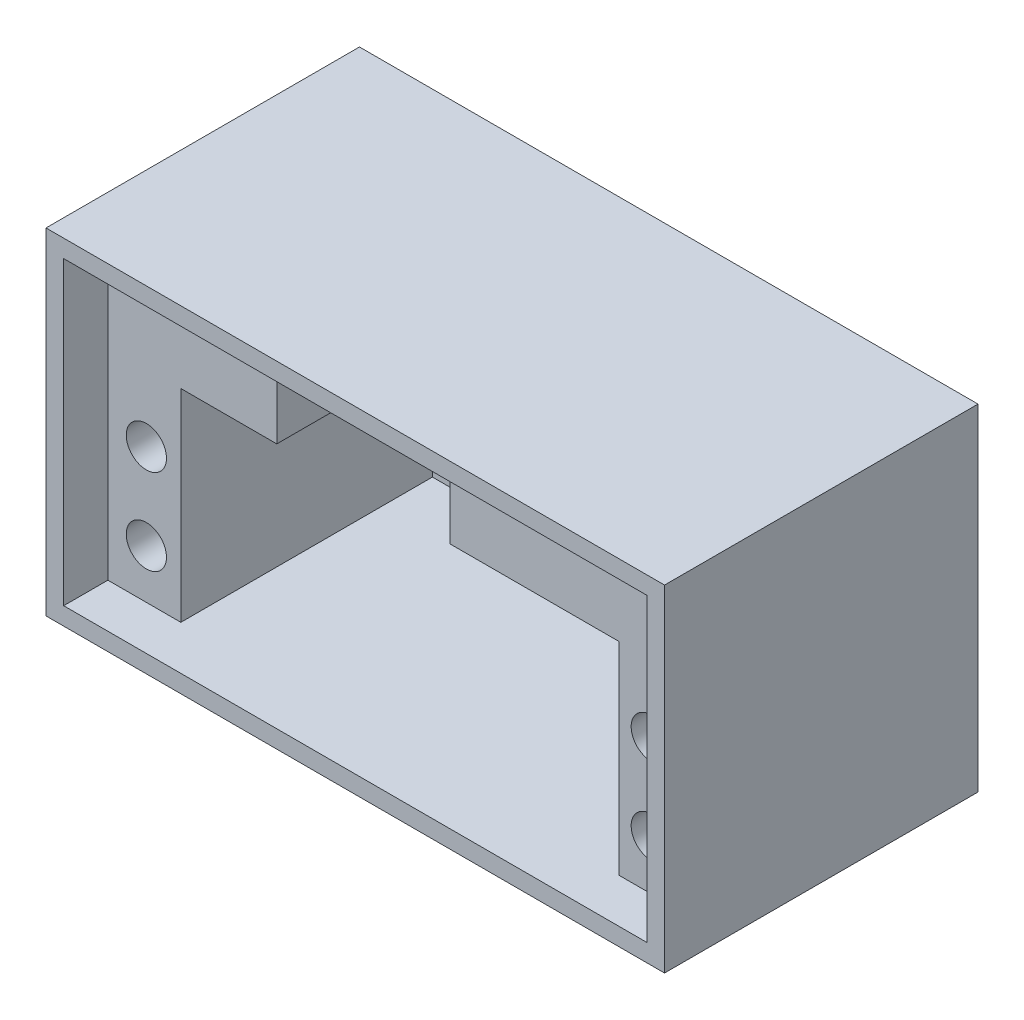
ISO-10303-21;
HEADER;
FILE_DESCRIPTION(('STEP AP214'),'2;1');
FILE_NAME('part.step','',(''),(''),'','','');
FILE_SCHEMA(('AUTOMOTIVE_DESIGN { 1 0 10303 214 1 1 1 1 }'));
ENDSEC;
DATA;
#1=APPLICATION_CONTEXT('core data for automotive mechanical design processes');
#2=APPLICATION_PROTOCOL_DEFINITION('international standard','automotive_design',2000,#1);
#3=PRODUCT_CONTEXT('',#1,'mechanical');
#4=PRODUCT('Part','Part','',(#3));
#5=PRODUCT_RELATED_PRODUCT_CATEGORY('part','',(#4));
#6=PRODUCT_DEFINITION_FORMATION('','',#4);
#7=PRODUCT_DEFINITION_CONTEXT('part definition',#1,'design');
#8=PRODUCT_DEFINITION('design','',#6,#7);
#9=PRODUCT_DEFINITION_SHAPE('','',#8);
#10=(LENGTH_UNIT() NAMED_UNIT(*) SI_UNIT(.MILLI.,.METRE.));
#11=(NAMED_UNIT(*) PLANE_ANGLE_UNIT() SI_UNIT($,.RADIAN.));
#12=(NAMED_UNIT(*) SI_UNIT($,.STERADIAN.) SOLID_ANGLE_UNIT());
#13=UNCERTAINTY_MEASURE_WITH_UNIT(LENGTH_MEASURE(1.E-05),#10,'distance_accuracy_value','');
#14=(GEOMETRIC_REPRESENTATION_CONTEXT(3) GLOBAL_UNCERTAINTY_ASSIGNED_CONTEXT((#13)) GLOBAL_UNIT_ASSIGNED_CONTEXT((#10,
#11,#12)) REPRESENTATION_CONTEXT('',''));
#15=CARTESIAN_POINT('',(0.,0.,0.));
#16=DIRECTION('',(0.,0.,1.));
#17=DIRECTION('',(1.,0.,0.));
#18=AXIS2_PLACEMENT_3D('',#15,#16,#17);
#19=CARTESIAN_POINT('',(0.,0.,0.));
#20=DIRECTION('',(0.,0.,1.));
#21=DIRECTION('',(1.,0.,0.));
#22=AXIS2_PLACEMENT_3D('',#19,#20,#21);
#23=PLANE('',#22);
#24=DIRECTION('',(1.,0.,0.));
#25=VECTOR('',#24,1.);
#26=CARTESIAN_POINT('',(0.,23.6,0.));
#27=LINE('',#26,#25);
#28=CARTESIAN_POINT('',(9.8,23.6,0.));
#29=VERTEX_POINT('',#28);
#30=CARTESIAN_POINT('',(37.05,23.6,0.));
#31=VERTEX_POINT('',#30);
#32=EDGE_CURVE('E12',#29,#31,#27,.T.);
#33=ORIENTED_EDGE('',*,*,#32,.F.);
#34=DIRECTION('',(0.,-1.,0.));
#35=VECTOR('',#34,1.);
#36=CARTESIAN_POINT('',(9.8,0.,0.));
#37=LINE('',#36,#35);
#38=CARTESIAN_POINT('',(9.8,12.5,0.));
#39=VERTEX_POINT('',#38);
#40=EDGE_CURVE('E280',#29,#39,#37,.T.);
#41=ORIENTED_EDGE('',*,*,#40,.T.);
#42=DIRECTION('',(1.,0.,0.));
#43=VECTOR('',#42,1.);
#44=CARTESIAN_POINT('',(0.,12.5,0.));
#45=LINE('',#44,#43);
#46=CARTESIAN_POINT('',(28.9,12.5,0.));
#47=VERTEX_POINT('',#46);
#48=EDGE_CURVE('E290',#39,#47,#45,.T.);
#49=ORIENTED_EDGE('',*,*,#48,.T.);
#50=DIRECTION('',(0.,1.,0.));
#51=VECTOR('',#50,1.);
#52=CARTESIAN_POINT('',(28.9,0.,0.));
#53=LINE('',#52,#51);
#54=CARTESIAN_POINT('',(28.9,-10.4,0.));
#55=VERTEX_POINT('',#54);
#56=EDGE_CURVE('E293',#55,#47,#53,.T.);
#57=ORIENTED_EDGE('',*,*,#56,.F.);
#58=DIRECTION('',(-1.,0.,0.));
#59=VECTOR('',#58,1.);
#60=CARTESIAN_POINT('',(0.,-10.3999999999999,0.));
#61=LINE('',#60,#59);
#62=CARTESIAN_POINT('',(37.05,-10.4,0.));
#63=VERTEX_POINT('',#62);
#64=EDGE_CURVE('E110',#63,#55,#61,.T.);
#65=ORIENTED_EDGE('',*,*,#64,.F.);
#66=DIRECTION('',(0.,-1.,0.));
#67=VECTOR('',#66,1.);
#68=CARTESIAN_POINT('',(37.05,0.,0.));
#69=LINE('',#68,#67);
#70=EDGE_CURVE('E106',#31,#63,#69,.T.);
#71=ORIENTED_EDGE('',*,*,#70,.F.);
#72=EDGE_LOOP('',(#33,#41,#49,#57,#65,#71));
#73=FACE_BOUND('',#72,.T.);
#74=CARTESIAN_POINT('',(32.55,4.84999999999999,0.));
#75=DIRECTION('',(0.,0.,1.));
#76=DIRECTION('',(1.,0.,0.));
#77=AXIS2_PLACEMENT_3D('',#74,#75,#76);
#78=CIRCLE('',#77,2.275);
#79=CARTESIAN_POINT('',(34.825,4.84999999999999,0.));
#80=VERTEX_POINT('',#79);
#81=EDGE_CURVE('E285',#80,#80,#78,.T.);
#82=ORIENTED_EDGE('',*,*,#81,.F.);
#83=EDGE_LOOP('',(#82));
#84=FACE_BOUND('',#83,.T.);
#85=CARTESIAN_POINT('',(32.55,-4.84999999999999,0.));
#86=DIRECTION('',(0.,0.,1.));
#87=DIRECTION('',(1.,0.,0.));
#88=AXIS2_PLACEMENT_3D('',#85,#86,#87);
#89=CIRCLE('',#88,2.275);
#90=CARTESIAN_POINT('',(34.825,-4.84999999999999,0.));
#91=VERTEX_POINT('',#90);
#92=EDGE_CURVE('E296',#91,#91,#89,.T.);
#93=ORIENTED_EDGE('',*,*,#92,.F.);
#94=EDGE_LOOP('',(#93));
#95=FACE_BOUND('',#94,.T.);
#96=ADVANCED_FACE('F88',(#73,#84,#95),#23,.T.);
#97=CARTESIAN_POINT('',(0.,0.,-28.45));
#98=DIRECTION('',(0.,0.,-1.));
#99=DIRECTION('',(-1.,0.,0.));
#100=AXIS2_PLACEMENT_3D('',#97,#98,#99);
#101=PLANE('',#100);
#102=DIRECTION('',(0.,1.,0.));
#103=VECTOR('',#102,1.);
#104=CARTESIAN_POINT('',(28.9,0.,-28.45));
#105=LINE('',#104,#103);
#106=CARTESIAN_POINT('',(28.9,-10.4,-28.45));
#107=VERTEX_POINT('',#106);
#108=CARTESIAN_POINT('',(28.9,12.5,-28.45));
#109=VERTEX_POINT('',#108);
#110=EDGE_CURVE('E284',#107,#109,#105,.T.);
#111=ORIENTED_EDGE('',*,*,#110,.T.);
#112=DIRECTION('',(1.,0.,0.));
#113=VECTOR('',#112,1.);
#114=CARTESIAN_POINT('',(0.,12.5,-28.45));
#115=LINE('',#114,#113);
#116=CARTESIAN_POINT('',(9.8,12.5,-28.45));
#117=VERTEX_POINT('',#116);
#118=EDGE_CURVE('E281',#117,#109,#115,.T.);
#119=ORIENTED_EDGE('',*,*,#118,.F.);
#120=DIRECTION('',(1.,0.,0.));
#121=VECTOR('',#120,1.);
#122=CARTESIAN_POINT('',(0.,12.5,-28.45));
#123=LINE('',#122,#121);
#124=CARTESIAN_POINT('',(-9.8,12.5,-28.45));
#125=VERTEX_POINT('',#124);
#126=EDGE_CURVE('E303',#125,#117,#123,.T.);
#127=ORIENTED_EDGE('',*,*,#126,.F.);
#128=DIRECTION('',(1.,0.,0.));
#129=VECTOR('',#128,1.);
#130=CARTESIAN_POINT('',(0.,12.5,-28.45));
#131=LINE('',#130,#129);
#132=CARTESIAN_POINT('',(-20.65,12.5,-28.45));
#133=VERTEX_POINT('',#132);
#134=EDGE_CURVE('E332',#133,#125,#131,.T.);
#135=ORIENTED_EDGE('',*,*,#134,.F.);
#136=DIRECTION('',(0.,-1.,0.));
#137=VECTOR('',#136,1.);
#138=CARTESIAN_POINT('',(-20.65,0.,-28.45));
#139=LINE('',#138,#137);
#140=CARTESIAN_POINT('',(-20.65,-10.3999999999999,-28.45));
#141=VERTEX_POINT('',#140);
#142=EDGE_CURVE('E329',#133,#141,#139,.T.);
#143=ORIENTED_EDGE('',*,*,#142,.T.);
#144=DIRECTION('',(1.,0.,0.));
#145=VECTOR('',#144,1.);
#146=CARTESIAN_POINT('',(0.,-10.4,-28.45));
#147=LINE('',#146,#145);
#148=EDGE_CURVE('E310',#141,#107,#147,.T.);
#149=ORIENTED_EDGE('',*,*,#148,.T.);
#150=EDGE_LOOP('',(#111,#119,#127,#135,#143,#149));
#151=FACE_BOUND('',#150,.T.);
#152=ADVANCED_FACE('F381',(#151),#101,.F.);
#153=CARTESIAN_POINT('',(-9.8,0.,-28.45));
#154=DIRECTION('',(1.,0.,0.));
#155=DIRECTION('',(0.,0.,-1.));
#156=AXIS2_PLACEMENT_3D('',#153,#154,#155);
#157=PLANE('',#156);
#158=DIRECTION('',(0.,1.,0.));
#159=VECTOR('',#158,1.);
#160=CARTESIAN_POINT('',(-9.8,0.,0.));
#161=LINE('',#160,#159);
#162=CARTESIAN_POINT('',(-9.8,12.5,0.));
#163=VERTEX_POINT('',#162);
#164=CARTESIAN_POINT('',(-9.8,23.6,0.));
#165=VERTEX_POINT('',#164);
#166=EDGE_CURVE('E348',#163,#165,#161,.T.);
#167=ORIENTED_EDGE('',*,*,#166,.F.);
#168=DIRECTION('',(0.,0.,1.));
#169=VECTOR('',#168,1.);
#170=CARTESIAN_POINT('',(-9.8,12.5,-28.45));
#171=LINE('',#170,#169);
#172=EDGE_CURVE('E359',#125,#163,#171,.T.);
#173=ORIENTED_EDGE('',*,*,#172,.F.);
#174=DIRECTION('',(0.,0.,1.));
#175=VECTOR('',#174,1.);
#176=CARTESIAN_POINT('',(-9.8,12.5,-30.45));
#177=LINE('',#176,#175);
#178=CARTESIAN_POINT('',(-9.8,12.5,-30.45));
#179=VERTEX_POINT('',#178);
#180=EDGE_CURVE('E316',#179,#125,#177,.T.);
#181=ORIENTED_EDGE('',*,*,#180,.F.);
#182=DIRECTION('',(0.,1.,0.));
#183=VECTOR('',#182,1.);
#184=CARTESIAN_POINT('',(-9.8,0.,-30.45));
#185=LINE('',#184,#183);
#186=CARTESIAN_POINT('',(-9.8,23.6,-30.45));
#187=VERTEX_POINT('',#186);
#188=EDGE_CURVE('E313',#179,#187,#185,.T.);
#189=ORIENTED_EDGE('',*,*,#188,.T.);
#190=DIRECTION('',(0.,0.,1.));
#191=VECTOR('',#190,1.);
#192=CARTESIAN_POINT('',(-9.8,23.6,-28.45));
#193=LINE('',#192,#191);
#194=EDGE_CURVE('E356',#187,#165,#193,.T.);
#195=ORIENTED_EDGE('',*,*,#194,.T.);
#196=EDGE_LOOP('',(#167,#173,#181,#189,#195));
#197=FACE_BOUND('',#196,.T.);
#198=ADVANCED_FACE('F403',(#197),#157,.T.);
#199=CARTESIAN_POINT('',(0.,12.5,-28.45));
#200=DIRECTION('',(0.,-1.,0.));
#201=DIRECTION('',(0.,0.,-1.));
#202=AXIS2_PLACEMENT_3D('',#199,#200,#201);
#203=PLANE('',#202);
#204=DIRECTION('',(1.,0.,0.));
#205=VECTOR('',#204,1.);
#206=CARTESIAN_POINT('',(0.,12.5,0.));
#207=LINE('',#206,#205);
#208=CARTESIAN_POINT('',(-20.65,12.5,0.));
#209=VERTEX_POINT('',#208);
#210=EDGE_CURVE('E345',#209,#163,#207,.T.);
#211=ORIENTED_EDGE('',*,*,#210,.F.);
#212=DIRECTION('',(0.,0.,1.));
#213=VECTOR('',#212,1.);
#214=CARTESIAN_POINT('',(-20.65,12.5,-28.45));
#215=LINE('',#214,#213);
#216=EDGE_CURVE('E361',#133,#209,#215,.T.);
#217=ORIENTED_EDGE('',*,*,#216,.F.);
#218=ORIENTED_EDGE('',*,*,#134,.T.);
#219=ORIENTED_EDGE('',*,*,#172,.T.);
#220=EDGE_LOOP('',(#211,#217,#218,#219));
#221=FACE_BOUND('',#220,.T.);
#222=ADVANCED_FACE('F406',(#221),#203,.T.);
#223=CARTESIAN_POINT('',(-20.65,0.,-28.45));
#224=DIRECTION('',(-1.,0.,0.));
#225=DIRECTION('',(0.,-1.,0.));
#226=AXIS2_PLACEMENT_3D('',#223,#224,#225);
#227=PLANE('',#226);
#228=DIRECTION('',(0.,-1.,0.));
#229=VECTOR('',#228,1.);
#230=CARTESIAN_POINT('',(-20.65,0.,0.));
#231=LINE('',#230,#229);
#232=CARTESIAN_POINT('',(-20.65,-10.3999999999999,0.));
#233=VERTEX_POINT('',#232);
#234=EDGE_CURVE('E328',#209,#233,#231,.T.);
#235=ORIENTED_EDGE('',*,*,#234,.T.);
#236=DIRECTION('',(0.,0.,1.));
#237=VECTOR('',#236,1.);
#238=CARTESIAN_POINT('',(-20.65,-10.4,-28.45));
#239=LINE('',#238,#237);
#240=EDGE_CURVE('E342',#141,#233,#239,.T.);
#241=ORIENTED_EDGE('',*,*,#240,.F.);
#242=ORIENTED_EDGE('',*,*,#142,.F.);
#243=ORIENTED_EDGE('',*,*,#216,.T.);
#244=EDGE_LOOP('',(#235,#241,#242,#243));
#245=FACE_BOUND('',#244,.T.);
#246=ADVANCED_FACE('F90',(#245),#227,.F.);
#247=CARTESIAN_POINT('',(-24.55,-4.85,-28.45));
#248=DIRECTION('',(0.,0.,1.));
#249=DIRECTION('',(1.,0.,0.));
#250=AXIS2_PLACEMENT_3D('',#247,#248,#249);
#251=CYLINDRICAL_SURFACE('',#250,2.275);
#252=CARTESIAN_POINT('',(-24.55,-4.85,-28.45));
#253=DIRECTION('',(0.,0.,1.));
#254=DIRECTION('',(1.,0.,0.));
#255=AXIS2_PLACEMENT_3D('',#252,#253,#254);
#256=CIRCLE('',#255,2.275);
#257=CARTESIAN_POINT('',(-22.275,-4.85,-28.45));
#258=VERTEX_POINT('',#257);
#259=EDGE_CURVE('E336',#258,#258,#256,.T.);
#260=ORIENTED_EDGE('',*,*,#259,.F.);
#261=EDGE_LOOP('',(#260));
#262=FACE_BOUND('',#261,.T.);
#263=CARTESIAN_POINT('',(-24.55,-4.85,0.));
#264=DIRECTION('',(0.,0.,1.));
#265=DIRECTION('',(1.,0.,0.));
#266=AXIS2_PLACEMENT_3D('',#263,#264,#265);
#267=CIRCLE('',#266,2.275);
#268=CARTESIAN_POINT('',(-22.275,-4.85,0.));
#269=VERTEX_POINT('',#268);
#270=EDGE_CURVE('E351',#269,#269,#267,.T.);
#271=ORIENTED_EDGE('',*,*,#270,.T.);
#272=EDGE_LOOP('',(#271));
#273=FACE_BOUND('',#272,.T.);
#274=ADVANCED_FACE('F461',(#262,#273),#251,.F.);
#275=CARTESIAN_POINT('',(-24.55,4.84999999999999,-28.45));
#276=DIRECTION('',(0.,0.,1.));
#277=DIRECTION('',(1.,0.,0.));
#278=AXIS2_PLACEMENT_3D('',#275,#276,#277);
#279=CYLINDRICAL_SURFACE('',#278,2.275);
#280=CARTESIAN_POINT('',(-24.55,4.84999999999999,-28.45));
#281=DIRECTION('',(0.,0.,1.));
#282=DIRECTION('',(1.,0.,0.));
#283=AXIS2_PLACEMENT_3D('',#280,#281,#282);
#284=CIRCLE('',#283,2.275);
#285=CARTESIAN_POINT('',(-22.275,4.84999999999999,-28.45));
#286=VERTEX_POINT('',#285);
#287=EDGE_CURVE('E339',#286,#286,#284,.T.);
#288=ORIENTED_EDGE('',*,*,#287,.F.);
#289=EDGE_LOOP('',(#288));
#290=FACE_BOUND('',#289,.T.);
#291=CARTESIAN_POINT('',(-24.55,4.84999999999999,0.));
#292=DIRECTION('',(0.,0.,1.));
#293=DIRECTION('',(1.,0.,0.));
#294=AXIS2_PLACEMENT_3D('',#291,#292,#293);
#295=CIRCLE('',#294,2.275);
#296=CARTESIAN_POINT('',(-22.275,4.84999999999999,0.));
#297=VERTEX_POINT('',#296);
#298=EDGE_CURVE('E333',#297,#297,#295,.T.);
#299=ORIENTED_EDGE('',*,*,#298,.T.);
#300=EDGE_LOOP('',(#299));
#301=FACE_BOUND('',#300,.T.);
#302=ADVANCED_FACE('F454',(#290,#301),#279,.F.);
#303=CARTESIAN_POINT('',(-28.9,23.6,0.));
#304=VERTEX_POINT('',#303);
#305=EDGE_CURVE('E99',#304,#165,#27,.T.);
#306=ORIENTED_EDGE('',*,*,#305,.F.);
#307=DIRECTION('',(0.,1.,0.));
#308=VECTOR('',#307,1.);
#309=CARTESIAN_POINT('',(-28.9,0.,0.));
#310=LINE('',#309,#308);
#311=CARTESIAN_POINT('',(-28.9,-10.3999999999999,0.));
#312=VERTEX_POINT('',#311);
#313=EDGE_CURVE('E232',#312,#304,#310,.T.);
#314=ORIENTED_EDGE('',*,*,#313,.F.);
#315=EDGE_CURVE('E97',#233,#312,#61,.T.);
#316=ORIENTED_EDGE('',*,*,#315,.F.);
#317=ORIENTED_EDGE('',*,*,#234,.F.);
#318=ORIENTED_EDGE('',*,*,#210,.T.);
#319=ORIENTED_EDGE('',*,*,#166,.T.);
#320=EDGE_LOOP('',(#306,#314,#316,#317,#318,#319));
#321=FACE_BOUND('',#320,.T.);
#322=ORIENTED_EDGE('',*,*,#270,.F.);
#323=EDGE_LOOP('',(#322));
#324=FACE_BOUND('',#323,.T.);
#325=ORIENTED_EDGE('',*,*,#298,.F.);
#326=EDGE_LOOP('',(#325));
#327=FACE_BOUND('',#326,.T.);
#328=ADVANCED_FACE('F408',(#321,#324,#327),#23,.T.);
#329=ORIENTED_EDGE('',*,*,#287,.T.);
#330=EDGE_LOOP('',(#329));
#331=FACE_BOUND('',#330,.T.);
#332=ADVANCED_FACE('F449',(#331),#101,.F.);
#333=ORIENTED_EDGE('',*,*,#259,.T.);
#334=EDGE_LOOP('',(#333));
#335=FACE_BOUND('',#334,.T.);
#336=ADVANCED_FACE('F459',(#335),#101,.F.);
#337=CARTESIAN_POINT('',(0.,12.5,-30.45));
#338=DIRECTION('',(0.,-1.,0.));
#339=DIRECTION('',(0.,0.,-1.));
#340=AXIS2_PLACEMENT_3D('',#337,#338,#339);
#341=PLANE('',#340);
#342=ORIENTED_EDGE('',*,*,#126,.T.);
#343=DIRECTION('',(0.,0.,1.));
#344=VECTOR('',#343,1.);
#345=CARTESIAN_POINT('',(9.8,12.5,-30.45));
#346=LINE('',#345,#344);
#347=CARTESIAN_POINT('',(9.8,12.5,-30.45));
#348=VERTEX_POINT('',#347);
#349=EDGE_CURVE('E325',#348,#117,#346,.T.);
#350=ORIENTED_EDGE('',*,*,#349,.F.);
#351=DIRECTION('',(1.,0.,0.));
#352=VECTOR('',#351,1.);
#353=CARTESIAN_POINT('',(0.,12.5,-30.45));
#354=LINE('',#353,#352);
#355=EDGE_CURVE('E307',#179,#348,#354,.T.);
#356=ORIENTED_EDGE('',*,*,#355,.F.);
#357=ORIENTED_EDGE('',*,*,#180,.T.);
#358=EDGE_LOOP('',(#342,#350,#356,#357));
#359=FACE_BOUND('',#358,.T.);
#360=ADVANCED_FACE('F399',(#359),#341,.F.);
#361=CARTESIAN_POINT('',(9.8,0.,-30.45));
#362=DIRECTION('',(-1.,0.,0.));
#363=DIRECTION('',(0.,0.,1.));
#364=AXIS2_PLACEMENT_3D('',#361,#362,#363);
#365=PLANE('',#364);
#366=ORIENTED_EDGE('',*,*,#349,.T.);
#367=DIRECTION('',(0.,0.,1.));
#368=VECTOR('',#367,1.);
#369=CARTESIAN_POINT('',(9.8,12.5,-28.45));
#370=LINE('',#369,#368);
#371=EDGE_CURVE('E287',#117,#39,#370,.T.);
#372=ORIENTED_EDGE('',*,*,#371,.T.);
#373=ORIENTED_EDGE('',*,*,#40,.F.);
#374=DIRECTION('',(0.,0.,1.));
#375=VECTOR('',#374,1.);
#376=CARTESIAN_POINT('',(9.8,23.6,-30.45));
#377=LINE('',#376,#375);
#378=CARTESIAN_POINT('',(9.8,23.6,-30.45));
#379=VERTEX_POINT('',#378);
#380=EDGE_CURVE('E323',#379,#29,#377,.T.);
#381=ORIENTED_EDGE('',*,*,#380,.F.);
#382=DIRECTION('',(0.,-1.,0.));
#383=VECTOR('',#382,1.);
#384=CARTESIAN_POINT('',(9.8,0.,-30.45));
#385=LINE('',#384,#383);
#386=EDGE_CURVE('E309',#379,#348,#385,.T.);
#387=ORIENTED_EDGE('',*,*,#386,.T.);
#388=EDGE_LOOP('',(#366,#372,#373,#381,#387));
#389=FACE_BOUND('',#388,.T.);
#390=ADVANCED_FACE('F393',(#389),#365,.T.);
#391=CARTESIAN_POINT('',(0.,0.,-30.45));
#392=DIRECTION('',(0.,0.,-1.));
#393=DIRECTION('',(-1.,0.,0.));
#394=AXIS2_PLACEMENT_3D('',#391,#392,#393);
#395=PLANE('',#394);
#396=ORIENTED_EDGE('',*,*,#386,.F.);
#397=DIRECTION('',(1.,0.,0.));
#398=VECTOR('',#397,1.);
#399=CARTESIAN_POINT('',(0.,23.6,-30.45));
#400=LINE('',#399,#398);
#401=EDGE_CURVE('E260',#187,#379,#400,.T.);
#402=ORIENTED_EDGE('',*,*,#401,.F.);
#403=ORIENTED_EDGE('',*,*,#188,.F.);
#404=ORIENTED_EDGE('',*,*,#355,.T.);
#405=EDGE_LOOP('',(#396,#402,#403,#404));
#406=FACE_BOUND('',#405,.T.);
#407=DIRECTION('',(-1.,0.,0.));
#408=VECTOR('',#407,1.);
#409=CARTESIAN_POINT('',(0.,-12.4,-30.45));
#410=LINE('',#409,#408);
#411=CARTESIAN_POINT('',(39.05,-12.4,-30.45));
#412=VERTEX_POINT('',#411);
#413=CARTESIAN_POINT('',(-30.9,-12.4,-30.45));
#414=VERTEX_POINT('',#413);
#415=EDGE_CURVE('E262',#412,#414,#410,.T.);
#416=ORIENTED_EDGE('',*,*,#415,.T.);
#417=DIRECTION('',(0.,1.,0.));
#418=VECTOR('',#417,1.);
#419=CARTESIAN_POINT('',(-30.9,0.,-30.45));
#420=LINE('',#419,#418);
#421=CARTESIAN_POINT('',(-30.9,25.6,-30.45));
#422=VERTEX_POINT('',#421);
#423=EDGE_CURVE('E269',#414,#422,#420,.T.);
#424=ORIENTED_EDGE('',*,*,#423,.T.);
#425=DIRECTION('',(-1.,0.,0.));
#426=VECTOR('',#425,1.);
#427=CARTESIAN_POINT('',(0.,25.6,-30.45));
#428=LINE('',#427,#426);
#429=CARTESIAN_POINT('',(39.05,25.6,-30.45));
#430=VERTEX_POINT('',#429);
#431=EDGE_CURVE('E267',#430,#422,#428,.T.);
#432=ORIENTED_EDGE('',*,*,#431,.F.);
#433=DIRECTION('',(0.,1.,0.));
#434=VECTOR('',#433,1.);
#435=CARTESIAN_POINT('',(39.05,0.,-30.45));
#436=LINE('',#435,#434);
#437=EDGE_CURVE('E265',#412,#430,#436,.T.);
#438=ORIENTED_EDGE('',*,*,#437,.F.);
#439=EDGE_LOOP('',(#416,#424,#432,#438));
#440=FACE_BOUND('',#439,.T.);
#441=ADVANCED_FACE('F412',(#406,#440),#395,.T.);
#442=CARTESIAN_POINT('',(28.9,0.,-28.45));
#443=DIRECTION('',(1.,0.,0.));
#444=DIRECTION('',(0.,1.,0.));
#445=AXIS2_PLACEMENT_3D('',#442,#443,#444);
#446=PLANE('',#445);
#447=ORIENTED_EDGE('',*,*,#56,.T.);
#448=DIRECTION('',(0.,0.,1.));
#449=VECTOR('',#448,1.);
#450=CARTESIAN_POINT('',(28.9,12.5,-28.45));
#451=LINE('',#450,#449);
#452=EDGE_CURVE('E304',#109,#47,#451,.T.);
#453=ORIENTED_EDGE('',*,*,#452,.F.);
#454=ORIENTED_EDGE('',*,*,#110,.F.);
#455=DIRECTION('',(0.,0.,1.));
#456=VECTOR('',#455,1.);
#457=CARTESIAN_POINT('',(28.9,-10.4,-28.45));
#458=LINE('',#457,#456);
#459=EDGE_CURVE('E301',#107,#55,#458,.T.);
#460=ORIENTED_EDGE('',*,*,#459,.T.);
#461=EDGE_LOOP('',(#447,#453,#454,#460));
#462=FACE_BOUND('',#461,.T.);
#463=ADVANCED_FACE('F385',(#462),#446,.F.);
#464=CARTESIAN_POINT('',(0.,12.5,-28.45));
#465=DIRECTION('',(0.,-1.,0.));
#466=DIRECTION('',(0.,0.,-1.));
#467=AXIS2_PLACEMENT_3D('',#464,#465,#466);
#468=PLANE('',#467);
#469=ORIENTED_EDGE('',*,*,#48,.F.);
#470=ORIENTED_EDGE('',*,*,#371,.F.);
#471=ORIENTED_EDGE('',*,*,#118,.T.);
#472=ORIENTED_EDGE('',*,*,#452,.T.);
#473=EDGE_LOOP('',(#469,#470,#471,#472));
#474=FACE_BOUND('',#473,.T.);
#475=ADVANCED_FACE('F389',(#474),#468,.T.);
#476=CARTESIAN_POINT('',(32.55,-4.84999999999999,-28.45));
#477=DIRECTION('',(0.,0.,1.));
#478=DIRECTION('',(1.,0.,0.));
#479=AXIS2_PLACEMENT_3D('',#476,#477,#478);
#480=CYLINDRICAL_SURFACE('',#479,2.275);
#481=CARTESIAN_POINT('',(32.55,-4.84999999999999,-28.45));
#482=DIRECTION('',(0.,0.,-1.));
#483=DIRECTION('',(-1.,0.,0.));
#484=AXIS2_PLACEMENT_3D('',#481,#482,#483);
#485=CIRCLE('',#484,2.275);
#486=CARTESIAN_POINT('',(30.275,-4.84999999999999,-28.45));
#487=VERTEX_POINT('',#486);
#488=EDGE_CURVE('E92',#487,#487,#485,.T.);
#489=ORIENTED_EDGE('',*,*,#488,.T.);
#490=EDGE_LOOP('',(#489));
#491=FACE_BOUND('',#490,.T.);
#492=ORIENTED_EDGE('',*,*,#92,.T.);
#493=EDGE_LOOP('',(#492));
#494=FACE_BOUND('',#493,.T.);
#495=ADVANCED_FACE('F532',(#491,#494),#480,.F.);
#496=CARTESIAN_POINT('',(32.55,4.84999999999999,-28.45));
#497=DIRECTION('',(0.,0.,1.));
#498=DIRECTION('',(1.,0.,0.));
#499=AXIS2_PLACEMENT_3D('',#496,#497,#498);
#500=CYLINDRICAL_SURFACE('',#499,2.275);
#501=CARTESIAN_POINT('',(32.55,4.84999999999999,-28.45));
#502=DIRECTION('',(0.,0.,-1.));
#503=DIRECTION('',(-1.,0.,0.));
#504=AXIS2_PLACEMENT_3D('',#501,#502,#503);
#505=CIRCLE('',#504,2.275);
#506=CARTESIAN_POINT('',(30.275,4.84999999999999,-28.45));
#507=VERTEX_POINT('',#506);
#508=EDGE_CURVE('E358',#507,#507,#505,.T.);
#509=ORIENTED_EDGE('',*,*,#508,.T.);
#510=EDGE_LOOP('',(#509));
#511=FACE_BOUND('',#510,.T.);
#512=ORIENTED_EDGE('',*,*,#81,.T.);
#513=EDGE_LOOP('',(#512));
#514=FACE_BOUND('',#513,.T.);
#515=ADVANCED_FACE('F543',(#511,#514),#500,.F.);
#516=ORIENTED_EDGE('',*,*,#508,.F.);
#517=EDGE_LOOP('',(#516));
#518=FACE_BOUND('',#517,.T.);
#519=ADVANCED_FACE('F513',(#518),#101,.F.);
#520=ORIENTED_EDGE('',*,*,#488,.F.);
#521=EDGE_LOOP('',(#520));
#522=FACE_BOUND('',#521,.T.);
#523=ADVANCED_FACE('F448',(#522),#101,.F.);
#524=CARTESIAN_POINT('',(0.,-10.3999999999999,-110.055291909521));
#525=DIRECTION('',(0.,1.,0.));
#526=DIRECTION('',(-1.,0.,0.));
#527=AXIS2_PLACEMENT_3D('',#524,#525,#526);
#528=PLANE('',#527);
#529=ORIENTED_EDGE('',*,*,#240,.T.);
#530=ORIENTED_EDGE('',*,*,#315,.T.);
#531=DIRECTION('',(0.,0.,-1.));
#532=VECTOR('',#531,1.);
#533=CARTESIAN_POINT('',(-28.9,-10.3999999999999,5.));
#534=LINE('',#533,#532);
#535=CARTESIAN_POINT('',(-28.9,-10.3999999999999,5.));
#536=VERTEX_POINT('',#535);
#537=EDGE_CURVE('E245',#536,#312,#534,.T.);
#538=ORIENTED_EDGE('',*,*,#537,.F.);
#539=DIRECTION('',(-1.,0.,0.));
#540=VECTOR('',#539,1.);
#541=CARTESIAN_POINT('',(0.,-10.3999999999999,5.));
#542=LINE('',#541,#540);
#543=CARTESIAN_POINT('',(37.05,-10.4,5.));
#544=VERTEX_POINT('',#543);
#545=EDGE_CURVE('E227',#544,#536,#542,.T.);
#546=ORIENTED_EDGE('',*,*,#545,.F.);
#547=DIRECTION('',(0.,0.,-1.));
#548=VECTOR('',#547,1.);
#549=CARTESIAN_POINT('',(37.05,-10.4,5.));
#550=LINE('',#549,#548);
#551=EDGE_CURVE('E218',#544,#63,#550,.T.);
#552=ORIENTED_EDGE('',*,*,#551,.T.);
#553=ORIENTED_EDGE('',*,*,#64,.T.);
#554=ORIENTED_EDGE('',*,*,#459,.F.);
#555=ORIENTED_EDGE('',*,*,#148,.F.);
#556=EDGE_LOOP('',(#529,#530,#538,#546,#552,#553,#554,#555));
#557=FACE_BOUND('',#556,.T.);
#558=ADVANCED_FACE('F372',(#557),#528,.T.);
#559=CARTESIAN_POINT('',(0.,-12.4,-110.055291909521));
#560=DIRECTION('',(0.,1.,0.));
#561=DIRECTION('',(0.,0.,1.));
#562=AXIS2_PLACEMENT_3D('',#559,#560,#561);
#563=PLANE('',#562);
#564=ORIENTED_EDGE('',*,*,#415,.F.);
#565=DIRECTION('',(0.,0.,1.));
#566=VECTOR('',#565,1.);
#567=CARTESIAN_POINT('',(39.05,-12.4,-110.055291909521));
#568=LINE('',#567,#566);
#569=CARTESIAN_POINT('',(39.05,-12.4,5.));
#570=VERTEX_POINT('',#569);
#571=EDGE_CURVE('E274',#412,#570,#568,.T.);
#572=ORIENTED_EDGE('',*,*,#571,.T.);
#573=DIRECTION('',(-1.,0.,0.));
#574=VECTOR('',#573,1.);
#575=CARTESIAN_POINT('',(0.,-12.4,5.));
#576=LINE('',#575,#574);
#577=CARTESIAN_POINT('',(-30.9,-12.4,5.));
#578=VERTEX_POINT('',#577);
#579=EDGE_CURVE('E257',#570,#578,#576,.T.);
#580=ORIENTED_EDGE('',*,*,#579,.T.);
#581=DIRECTION('',(0.,0.,1.));
#582=VECTOR('',#581,1.);
#583=CARTESIAN_POINT('',(-30.9,-12.4,-110.055291909521));
#584=LINE('',#583,#582);
#585=EDGE_CURVE('E272',#414,#578,#584,.T.);
#586=ORIENTED_EDGE('',*,*,#585,.F.);
#587=EDGE_LOOP('',(#564,#572,#580,#586));
#588=FACE_BOUND('',#587,.T.);
#589=ADVANCED_FACE('F421',(#588),#563,.F.);
#590=CARTESIAN_POINT('',(39.05,0.,-110.055291909521));
#591=DIRECTION('',(1.,0.,0.));
#592=DIRECTION('',(0.,1.,0.));
#593=AXIS2_PLACEMENT_3D('',#590,#591,#592);
#594=PLANE('',#593);
#595=ORIENTED_EDGE('',*,*,#571,.F.);
#596=ORIENTED_EDGE('',*,*,#437,.T.);
#597=DIRECTION('',(0.,0.,1.));
#598=VECTOR('',#597,1.);
#599=CARTESIAN_POINT('',(39.05,25.6,-110.055291909521));
#600=LINE('',#599,#598);
#601=CARTESIAN_POINT('',(39.05,25.6,5.));
#602=VERTEX_POINT('',#601);
#603=EDGE_CURVE('E276',#430,#602,#600,.T.);
#604=ORIENTED_EDGE('',*,*,#603,.T.);
#605=DIRECTION('',(0.,1.,0.));
#606=VECTOR('',#605,1.);
#607=CARTESIAN_POINT('',(39.05,0.,5.));
#608=LINE('',#607,#606);
#609=EDGE_CURVE('E254',#570,#602,#608,.T.);
#610=ORIENTED_EDGE('',*,*,#609,.F.);
#611=EDGE_LOOP('',(#595,#596,#604,#610));
#612=FACE_BOUND('',#611,.T.);
#613=ADVANCED_FACE('F433',(#612),#594,.T.);
#614=CARTESIAN_POINT('',(0.,25.6,-110.055291909521));
#615=DIRECTION('',(0.,1.,0.));
#616=DIRECTION('',(0.,0.,1.));
#617=AXIS2_PLACEMENT_3D('',#614,#615,#616);
#618=PLANE('',#617);
#619=ORIENTED_EDGE('',*,*,#603,.F.);
#620=ORIENTED_EDGE('',*,*,#431,.T.);
#621=DIRECTION('',(0.,0.,1.));
#622=VECTOR('',#621,1.);
#623=CARTESIAN_POINT('',(-30.9,25.6,-110.055291909521));
#624=LINE('',#623,#622);
#625=CARTESIAN_POINT('',(-30.9,25.6,5.));
#626=VERTEX_POINT('',#625);
#627=EDGE_CURVE('E278',#422,#626,#624,.T.);
#628=ORIENTED_EDGE('',*,*,#627,.T.);
#629=DIRECTION('',(-1.,0.,0.));
#630=VECTOR('',#629,1.);
#631=CARTESIAN_POINT('',(0.,25.6,5.));
#632=LINE('',#631,#630);
#633=EDGE_CURVE('E251',#602,#626,#632,.T.);
#634=ORIENTED_EDGE('',*,*,#633,.F.);
#635=EDGE_LOOP('',(#619,#620,#628,#634));
#636=FACE_BOUND('',#635,.T.);
#637=ADVANCED_FACE('F431',(#636),#618,.T.);
#638=CARTESIAN_POINT('',(-30.9,0.,-110.055291909521));
#639=DIRECTION('',(1.,0.,0.));
#640=DIRECTION('',(0.,0.,-1.));
#641=AXIS2_PLACEMENT_3D('',#638,#639,#640);
#642=PLANE('',#641);
#643=ORIENTED_EDGE('',*,*,#423,.F.);
#644=ORIENTED_EDGE('',*,*,#585,.T.);
#645=DIRECTION('',(0.,1.,0.));
#646=VECTOR('',#645,1.);
#647=CARTESIAN_POINT('',(-30.9,0.,5.));
#648=LINE('',#647,#646);
#649=EDGE_CURVE('E244',#578,#626,#648,.T.);
#650=ORIENTED_EDGE('',*,*,#649,.T.);
#651=ORIENTED_EDGE('',*,*,#627,.F.);
#652=EDGE_LOOP('',(#643,#644,#650,#651));
#653=FACE_BOUND('',#652,.T.);
#654=ADVANCED_FACE('F427',(#653),#642,.F.);
#655=CARTESIAN_POINT('',(0.,23.6,-110.055291909521));
#656=DIRECTION('',(0.,-1.,0.));
#657=DIRECTION('',(0.,0.,-1.));
#658=AXIS2_PLACEMENT_3D('',#655,#656,#657);
#659=PLANE('',#658);
#660=ORIENTED_EDGE('',*,*,#380,.T.);
#661=ORIENTED_EDGE('',*,*,#32,.T.);
#662=DIRECTION('',(0.,0.,-1.));
#663=VECTOR('',#662,1.);
#664=CARTESIAN_POINT('',(37.05,23.6,5.));
#665=LINE('',#664,#663);
#666=CARTESIAN_POINT('',(37.05,23.6,5.));
#667=VERTEX_POINT('',#666);
#668=EDGE_CURVE('E209',#667,#31,#665,.T.);
#669=ORIENTED_EDGE('',*,*,#668,.F.);
#670=DIRECTION('',(1.,0.,0.));
#671=VECTOR('',#670,1.);
#672=CARTESIAN_POINT('',(0.,23.6,5.));
#673=LINE('',#672,#671);
#674=CARTESIAN_POINT('',(-28.9,23.6,5.));
#675=VERTEX_POINT('',#674);
#676=EDGE_CURVE('E215',#675,#667,#673,.T.);
#677=ORIENTED_EDGE('',*,*,#676,.F.);
#678=DIRECTION('',(0.,0.,-1.));
#679=VECTOR('',#678,1.);
#680=CARTESIAN_POINT('',(-28.9,23.6,5.));
#681=LINE('',#680,#679);
#682=EDGE_CURVE('E242',#675,#304,#681,.T.);
#683=ORIENTED_EDGE('',*,*,#682,.T.);
#684=ORIENTED_EDGE('',*,*,#305,.T.);
#685=ORIENTED_EDGE('',*,*,#194,.F.);
#686=ORIENTED_EDGE('',*,*,#401,.T.);
#687=EDGE_LOOP('',(#660,#661,#669,#677,#683,#684,#685,#686));
#688=FACE_BOUND('',#687,.T.);
#689=ADVANCED_FACE('F212',(#688),#659,.T.);
#690=CARTESIAN_POINT('',(0.,0.,5.));
#691=DIRECTION('',(0.,0.,1.));
#692=DIRECTION('',(1.,0.,0.));
#693=AXIS2_PLACEMENT_3D('',#690,#691,#692);
#694=PLANE('',#693);
#695=ORIENTED_EDGE('',*,*,#676,.T.);
#696=DIRECTION('',(0.,-1.,0.));
#697=VECTOR('',#696,1.);
#698=CARTESIAN_POINT('',(37.05,0.,5.));
#699=LINE('',#698,#697);
#700=EDGE_CURVE('E223',#667,#544,#699,.T.);
#701=ORIENTED_EDGE('',*,*,#700,.T.);
#702=ORIENTED_EDGE('',*,*,#545,.T.);
#703=DIRECTION('',(0.,1.,0.));
#704=VECTOR('',#703,1.);
#705=CARTESIAN_POINT('',(-28.9,0.,5.));
#706=LINE('',#705,#704);
#707=EDGE_CURVE('E219',#536,#675,#706,.T.);
#708=ORIENTED_EDGE('',*,*,#707,.T.);
#709=EDGE_LOOP('',(#695,#701,#702,#708));
#710=FACE_BOUND('',#709,.T.);
#711=ORIENTED_EDGE('',*,*,#649,.F.);
#712=ORIENTED_EDGE('',*,*,#579,.F.);
#713=ORIENTED_EDGE('',*,*,#609,.T.);
#714=ORIENTED_EDGE('',*,*,#633,.T.);
#715=EDGE_LOOP('',(#711,#712,#713,#714));
#716=FACE_BOUND('',#715,.T.);
#717=ADVANCED_FACE('F229',(#710,#716),#694,.T.);
#718=CARTESIAN_POINT('',(-28.9,0.,5.));
#719=DIRECTION('',(-1.,0.,0.));
#720=DIRECTION('',(0.,-1.,0.));
#721=AXIS2_PLACEMENT_3D('',#718,#719,#720);
#722=PLANE('',#721);
#723=ORIENTED_EDGE('',*,*,#313,.T.);
#724=ORIENTED_EDGE('',*,*,#682,.F.);
#725=ORIENTED_EDGE('',*,*,#707,.F.);
#726=ORIENTED_EDGE('',*,*,#537,.T.);
#727=EDGE_LOOP('',(#723,#724,#725,#726));
#728=FACE_BOUND('',#727,.T.);
#729=ADVANCED_FACE('F377',(#728),#722,.F.);
#730=CARTESIAN_POINT('',(37.05,0.,5.));
#731=DIRECTION('',(1.,0.,0.));
#732=DIRECTION('',(0.,0.,-1.));
#733=AXIS2_PLACEMENT_3D('',#730,#731,#732);
#734=PLANE('',#733);
#735=ORIENTED_EDGE('',*,*,#70,.T.);
#736=ORIENTED_EDGE('',*,*,#551,.F.);
#737=ORIENTED_EDGE('',*,*,#700,.F.);
#738=ORIENTED_EDGE('',*,*,#668,.T.);
#739=EDGE_LOOP('',(#735,#736,#737,#738));
#740=FACE_BOUND('',#739,.T.);
#741=ADVANCED_FACE('F224',(#740),#734,.F.);
#742=CLOSED_SHELL('',(#96,#152,#198,#222,#246,#274,#302,#328,#332,#336,#360,#390,#441,#463,#475,
#495,#515,#519,#523,#558,#589,#613,#637,#654,#689,#717,#729,#741));
#743=MANIFOLD_SOLID_BREP('B2',#742);
#744=ADVANCED_BREP_SHAPE_REPRESENTATION('',(#18,#743),#14);
#745=SHAPE_DEFINITION_REPRESENTATION(#9,#744);
ENDSEC;
END-ISO-10303-21;
